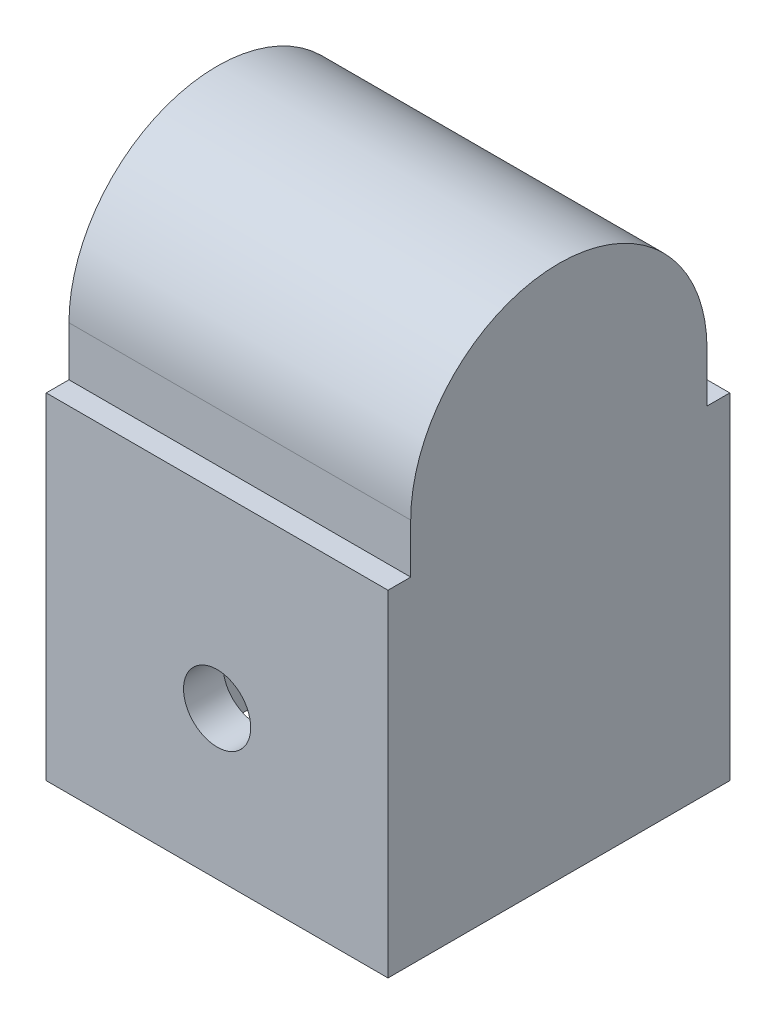
ISO-10303-21;
HEADER;
FILE_DESCRIPTION(('STEP AP214'),'2;1');
FILE_NAME('part.step','',(''),(''),'','','');
FILE_SCHEMA(('AUTOMOTIVE_DESIGN { 1 0 10303 214 1 1 1 1 }'));
ENDSEC;
DATA;
#1=APPLICATION_CONTEXT('core data for automotive mechanical design processes');
#2=APPLICATION_PROTOCOL_DEFINITION('international standard','automotive_design',2000,#1);
#3=PRODUCT_CONTEXT('',#1,'mechanical');
#4=PRODUCT('Part','Part','',(#3));
#5=PRODUCT_RELATED_PRODUCT_CATEGORY('part','',(#4));
#6=PRODUCT_DEFINITION_FORMATION('','',#4);
#7=PRODUCT_DEFINITION_CONTEXT('part definition',#1,'design');
#8=PRODUCT_DEFINITION('design','',#6,#7);
#9=PRODUCT_DEFINITION_SHAPE('','',#8);
#10=(LENGTH_UNIT() NAMED_UNIT(*) SI_UNIT(.MILLI.,.METRE.));
#11=(NAMED_UNIT(*) PLANE_ANGLE_UNIT() SI_UNIT($,.RADIAN.));
#12=(NAMED_UNIT(*) SI_UNIT($,.STERADIAN.) SOLID_ANGLE_UNIT());
#13=UNCERTAINTY_MEASURE_WITH_UNIT(LENGTH_MEASURE(1.E-05),#10,'distance_accuracy_value','');
#14=(GEOMETRIC_REPRESENTATION_CONTEXT(3) GLOBAL_UNCERTAINTY_ASSIGNED_CONTEXT((#13)) GLOBAL_UNIT_ASSIGNED_CONTEXT((#10,
#11,#12)) REPRESENTATION_CONTEXT('',''));
#15=CARTESIAN_POINT('',(0.,0.,0.));
#16=DIRECTION('',(0.,0.,1.));
#17=DIRECTION('',(1.,0.,0.));
#18=AXIS2_PLACEMENT_3D('',#15,#16,#17);
#19=CARTESIAN_POINT('',(0.,2.,0.));
#20=DIRECTION('',(0.,1.,0.));
#21=DIRECTION('',(0.,0.,1.));
#22=AXIS2_PLACEMENT_3D('',#19,#20,#21);
#23=PLANE('',#22);
#24=DIRECTION('',(0.,0.,-1.));
#25=VECTOR('',#24,1.);
#26=CARTESIAN_POINT('',(8.65,2.,0.));
#27=LINE('',#26,#25);
#28=CARTESIAN_POINT('',(8.65,2.,8.65));
#29=VERTEX_POINT('',#28);
#30=CARTESIAN_POINT('',(8.65,2.,7.5));
#31=VERTEX_POINT('',#30);
#32=EDGE_CURVE('E100',#29,#31,#27,.T.);
#33=ORIENTED_EDGE('',*,*,#32,.T.);
#34=DIRECTION('',(-1.,0.,0.));
#35=VECTOR('',#34,1.);
#36=CARTESIAN_POINT('',(8.65,2.,7.5));
#37=LINE('',#36,#35);
#38=CARTESIAN_POINT('',(-8.65,2.,7.5));
#39=VERTEX_POINT('',#38);
#40=EDGE_CURVE('E199',#31,#39,#37,.T.);
#41=ORIENTED_EDGE('',*,*,#40,.T.);
#42=DIRECTION('',(0.,0.,-1.));
#43=VECTOR('',#42,1.);
#44=CARTESIAN_POINT('',(-8.65,2.,0.));
#45=LINE('',#44,#43);
#46=CARTESIAN_POINT('',(-8.65,2.,8.65));
#47=VERTEX_POINT('',#46);
#48=EDGE_CURVE('E212',#47,#39,#45,.T.);
#49=ORIENTED_EDGE('',*,*,#48,.F.);
#50=DIRECTION('',(1.,0.,0.));
#51=VECTOR('',#50,1.);
#52=CARTESIAN_POINT('',(0.,2.,8.65));
#53=LINE('',#52,#51);
#54=EDGE_CURVE('E214',#47,#29,#53,.T.);
#55=ORIENTED_EDGE('',*,*,#54,.T.);
#56=EDGE_LOOP('',(#33,#41,#49,#55));
#57=FACE_BOUND('',#56,.T.);
#58=ADVANCED_FACE('F38',(#57),#23,.T.);
#59=CARTESIAN_POINT('',(-8.65,-15.,8.65));
#60=DIRECTION('',(-1.,0.,0.));
#61=DIRECTION('',(0.,0.,1.));
#62=AXIS2_PLACEMENT_3D('',#59,#60,#61);
#63=PLANE('',#62);
#64=DIRECTION('',(0.,1.,0.));
#65=VECTOR('',#64,1.);
#66=CARTESIAN_POINT('',(-8.65,-15.,8.65));
#67=LINE('',#66,#65);
#68=CARTESIAN_POINT('',(-8.65,-15.,8.65));
#69=VERTEX_POINT('',#68);
#70=EDGE_CURVE('E269',#69,#47,#67,.T.);
#71=ORIENTED_EDGE('',*,*,#70,.T.);
#72=ORIENTED_EDGE('',*,*,#48,.T.);
#73=DIRECTION('',(0.,-1.,0.));
#74=VECTOR('',#73,1.);
#75=CARTESIAN_POINT('',(-8.65,4.5,7.5));
#76=LINE('',#75,#74);
#77=CARTESIAN_POINT('',(-8.65,4.5,7.5));
#78=VERTEX_POINT('',#77);
#79=EDGE_CURVE('E187',#78,#39,#76,.T.);
#80=ORIENTED_EDGE('',*,*,#79,.F.);
#81=CARTESIAN_POINT('',(-8.65,4.5,0.));
#82=DIRECTION('',(1.,0.,0.));
#83=DIRECTION('',(0.,0.,-1.));
#84=AXIS2_PLACEMENT_3D('',#81,#82,#83);
#85=CIRCLE('',#84,7.5);
#86=CARTESIAN_POINT('',(-8.65,4.5,-7.5));
#87=VERTEX_POINT('',#86);
#88=EDGE_CURVE('E171',#87,#78,#85,.T.);
#89=ORIENTED_EDGE('',*,*,#88,.F.);
#90=DIRECTION('',(0.,1.,0.));
#91=VECTOR('',#90,1.);
#92=CARTESIAN_POINT('',(-8.65,2.,-7.5));
#93=LINE('',#92,#91);
#94=CARTESIAN_POINT('',(-8.65,2.,-7.5));
#95=VERTEX_POINT('',#94);
#96=EDGE_CURVE('E184',#95,#87,#93,.T.);
#97=ORIENTED_EDGE('',*,*,#96,.F.);
#98=CARTESIAN_POINT('',(-8.65,2.,-8.65));
#99=VERTEX_POINT('',#98);
#100=EDGE_CURVE('E211',#95,#99,#45,.T.);
#101=ORIENTED_EDGE('',*,*,#100,.T.);
#102=DIRECTION('',(0.,1.,0.));
#103=VECTOR('',#102,1.);
#104=CARTESIAN_POINT('',(-8.65,-15.,-8.65));
#105=LINE('',#104,#103);
#106=CARTESIAN_POINT('',(-8.65,-15.,-8.65));
#107=VERTEX_POINT('',#106);
#108=EDGE_CURVE('E270',#107,#99,#105,.T.);
#109=ORIENTED_EDGE('',*,*,#108,.F.);
#110=DIRECTION('',(0.,0.,1.));
#111=VECTOR('',#110,1.);
#112=CARTESIAN_POINT('',(-8.65,-15.,8.65));
#113=LINE('',#112,#111);
#114=EDGE_CURVE('E249',#107,#69,#113,.T.);
#115=ORIENTED_EDGE('',*,*,#114,.T.);
#116=EDGE_LOOP('',(#71,#72,#80,#89,#97,#101,#109,#115));
#117=FACE_BOUND('',#116,.T.);
#118=ADVANCED_FACE('F183',(#117),#63,.T.);
#119=CARTESIAN_POINT('',(-8.65,-15.,-8.65));
#120=DIRECTION('',(0.,0.,-1.));
#121=DIRECTION('',(-1.,0.,0.));
#122=AXIS2_PLACEMENT_3D('',#119,#120,#121);
#123=PLANE('',#122);
#124=CARTESIAN_POINT('',(0.,-7.5,-8.65));
#125=DIRECTION('',(0.,0.,1.));
#126=DIRECTION('',(1.,0.,0.));
#127=AXIS2_PLACEMENT_3D('',#124,#125,#126);
#128=CIRCLE('',#127,1.7);
#129=CARTESIAN_POINT('',(1.7,-7.5,-8.65));
#130=VERTEX_POINT('',#129);
#131=EDGE_CURVE('E204',#130,#130,#128,.T.);
#132=ORIENTED_EDGE('',*,*,#131,.T.);
#133=EDGE_LOOP('',(#132));
#134=FACE_BOUND('',#133,.T.);
#135=ORIENTED_EDGE('',*,*,#108,.T.);
#136=DIRECTION('',(1.,0.,0.));
#137=VECTOR('',#136,1.);
#138=CARTESIAN_POINT('',(0.,2.,-8.65));
#139=LINE('',#138,#137);
#140=CARTESIAN_POINT('',(8.65,2.,-8.65));
#141=VERTEX_POINT('',#140);
#142=EDGE_CURVE('E218',#99,#141,#139,.T.);
#143=ORIENTED_EDGE('',*,*,#142,.T.);
#144=DIRECTION('',(0.,1.,0.));
#145=VECTOR('',#144,1.);
#146=CARTESIAN_POINT('',(8.65,-15.,-8.65));
#147=LINE('',#146,#145);
#148=CARTESIAN_POINT('',(8.65,-15.,-8.65));
#149=VERTEX_POINT('',#148);
#150=EDGE_CURVE('E273',#149,#141,#147,.T.);
#151=ORIENTED_EDGE('',*,*,#150,.F.);
#152=DIRECTION('',(-1.,0.,0.));
#153=VECTOR('',#152,1.);
#154=CARTESIAN_POINT('',(-8.65,-15.,-8.65));
#155=LINE('',#154,#153);
#156=EDGE_CURVE('E266',#149,#107,#155,.T.);
#157=ORIENTED_EDGE('',*,*,#156,.T.);
#158=EDGE_LOOP('',(#135,#143,#151,#157));
#159=FACE_BOUND('',#158,.T.);
#160=ADVANCED_FACE('F415',(#134,#159),#123,.T.);
#161=CARTESIAN_POINT('',(8.65,-15.,8.65));
#162=DIRECTION('',(1.,0.,0.));
#163=DIRECTION('',(0.,0.,-1.));
#164=AXIS2_PLACEMENT_3D('',#161,#162,#163);
#165=PLANE('',#164);
#166=ORIENTED_EDGE('',*,*,#150,.T.);
#167=CARTESIAN_POINT('',(8.65,2.,-7.5));
#168=VERTEX_POINT('',#167);
#169=EDGE_CURVE('E216',#168,#141,#27,.T.);
#170=ORIENTED_EDGE('',*,*,#169,.F.);
#171=DIRECTION('',(0.,1.,0.));
#172=VECTOR('',#171,1.);
#173=CARTESIAN_POINT('',(8.65,2.,-7.5));
#174=LINE('',#173,#172);
#175=CARTESIAN_POINT('',(8.65,4.5,-7.5));
#176=VERTEX_POINT('',#175);
#177=EDGE_CURVE('E193',#168,#176,#174,.T.);
#178=ORIENTED_EDGE('',*,*,#177,.T.);
#179=CARTESIAN_POINT('',(8.65,4.5,0.));
#180=DIRECTION('',(1.,0.,0.));
#181=DIRECTION('',(0.,0.,-1.));
#182=AXIS2_PLACEMENT_3D('',#179,#180,#181);
#183=CIRCLE('',#182,7.5);
#184=CARTESIAN_POINT('',(8.65,4.5,7.5));
#185=VERTEX_POINT('',#184);
#186=EDGE_CURVE('E172',#176,#185,#183,.T.);
#187=ORIENTED_EDGE('',*,*,#186,.T.);
#188=DIRECTION('',(0.,-1.,0.));
#189=VECTOR('',#188,1.);
#190=CARTESIAN_POINT('',(8.65,4.5,7.5));
#191=LINE('',#190,#189);
#192=EDGE_CURVE('E196',#185,#31,#191,.T.);
#193=ORIENTED_EDGE('',*,*,#192,.T.);
#194=ORIENTED_EDGE('',*,*,#32,.F.);
#195=DIRECTION('',(0.,1.,0.));
#196=VECTOR('',#195,1.);
#197=CARTESIAN_POINT('',(8.65,-15.,8.65));
#198=LINE('',#197,#196);
#199=CARTESIAN_POINT('',(8.65,-15.,8.65));
#200=VERTEX_POINT('',#199);
#201=EDGE_CURVE('E276',#200,#29,#198,.T.);
#202=ORIENTED_EDGE('',*,*,#201,.F.);
#203=DIRECTION('',(0.,0.,-1.));
#204=VECTOR('',#203,1.);
#205=CARTESIAN_POINT('',(8.65,-15.,8.65));
#206=LINE('',#205,#204);
#207=EDGE_CURVE('E263',#200,#149,#206,.T.);
#208=ORIENTED_EDGE('',*,*,#207,.T.);
#209=EDGE_LOOP('',(#166,#170,#178,#187,#193,#194,#202,#208));
#210=FACE_BOUND('',#209,.T.);
#211=ADVANCED_FACE('F410',(#210),#165,.T.);
#212=CARTESIAN_POINT('',(-8.65,-15.,8.65));
#213=DIRECTION('',(0.,0.,1.));
#214=DIRECTION('',(1.,0.,0.));
#215=AXIS2_PLACEMENT_3D('',#212,#213,#214);
#216=PLANE('',#215);
#217=CARTESIAN_POINT('',(0.,-7.5,8.65));
#218=DIRECTION('',(0.,0.,1.));
#219=DIRECTION('',(1.,0.,0.));
#220=AXIS2_PLACEMENT_3D('',#217,#218,#219);
#221=CIRCLE('',#220,1.7);
#222=CARTESIAN_POINT('',(1.7,-7.5,8.65));
#223=VERTEX_POINT('',#222);
#224=EDGE_CURVE('E177',#223,#223,#221,.T.);
#225=ORIENTED_EDGE('',*,*,#224,.F.);
#226=EDGE_LOOP('',(#225));
#227=FACE_BOUND('',#226,.T.);
#228=ORIENTED_EDGE('',*,*,#201,.T.);
#229=ORIENTED_EDGE('',*,*,#54,.F.);
#230=ORIENTED_EDGE('',*,*,#70,.F.);
#231=DIRECTION('',(1.,0.,0.));
#232=VECTOR('',#231,1.);
#233=CARTESIAN_POINT('',(-8.65,-15.,8.65));
#234=LINE('',#233,#232);
#235=EDGE_CURVE('E260',#69,#200,#234,.T.);
#236=ORIENTED_EDGE('',*,*,#235,.T.);
#237=EDGE_LOOP('',(#228,#229,#230,#236));
#238=FACE_BOUND('',#237,.T.);
#239=ADVANCED_FACE('F414',(#227,#238),#216,.T.);
#240=CARTESIAN_POINT('',(0.,-15.,0.));
#241=DIRECTION('',(0.,-1.,0.));
#242=DIRECTION('',(0.,0.,-1.));
#243=AXIS2_PLACEMENT_3D('',#240,#241,#242);
#244=PLANE('',#243);
#245=DIRECTION('',(0.,0.,-1.));
#246=VECTOR('',#245,1.);
#247=CARTESIAN_POINT('',(6.65,-15.,6.65));
#248=LINE('',#247,#246);
#249=CARTESIAN_POINT('',(6.65,-15.,6.65));
#250=VERTEX_POINT('',#249);
#251=CARTESIAN_POINT('',(6.65,-15.,-6.65));
#252=VERTEX_POINT('',#251);
#253=EDGE_CURVE('E222',#250,#252,#248,.T.);
#254=ORIENTED_EDGE('',*,*,#253,.T.);
#255=DIRECTION('',(-1.,0.,0.));
#256=VECTOR('',#255,1.);
#257=CARTESIAN_POINT('',(-6.65,-15.,-6.65));
#258=LINE('',#257,#256);
#259=CARTESIAN_POINT('',(-6.65,-15.,-6.65));
#260=VERTEX_POINT('',#259);
#261=EDGE_CURVE('E225',#252,#260,#258,.T.);
#262=ORIENTED_EDGE('',*,*,#261,.T.);
#263=DIRECTION('',(0.,0.,1.));
#264=VECTOR('',#263,1.);
#265=CARTESIAN_POINT('',(-6.65,-15.,6.65));
#266=LINE('',#265,#264);
#267=CARTESIAN_POINT('',(-6.65,-15.,6.65));
#268=VERTEX_POINT('',#267);
#269=EDGE_CURVE('E229',#260,#268,#266,.T.);
#270=ORIENTED_EDGE('',*,*,#269,.T.);
#271=DIRECTION('',(1.,0.,0.));
#272=VECTOR('',#271,1.);
#273=CARTESIAN_POINT('',(-6.65,-15.,6.65));
#274=LINE('',#273,#272);
#275=EDGE_CURVE('E232',#268,#250,#274,.T.);
#276=ORIENTED_EDGE('',*,*,#275,.T.);
#277=EDGE_LOOP('',(#254,#262,#270,#276));
#278=FACE_BOUND('',#277,.T.);
#279=ORIENTED_EDGE('',*,*,#114,.F.);
#280=ORIENTED_EDGE('',*,*,#156,.F.);
#281=ORIENTED_EDGE('',*,*,#207,.F.);
#282=ORIENTED_EDGE('',*,*,#235,.F.);
#283=EDGE_LOOP('',(#279,#280,#281,#282));
#284=FACE_BOUND('',#283,.T.);
#285=ADVANCED_FACE('F482',(#278,#284),#244,.T.);
#286=CARTESIAN_POINT('',(6.65,-15.,6.65));
#287=DIRECTION('',(1.,0.,0.));
#288=DIRECTION('',(0.,0.,-1.));
#289=AXIS2_PLACEMENT_3D('',#286,#287,#288);
#290=PLANE('',#289);
#291=DIRECTION('',(0.,0.,-1.));
#292=VECTOR('',#291,1.);
#293=CARTESIAN_POINT('',(6.65,0.,6.65));
#294=LINE('',#293,#292);
#295=CARTESIAN_POINT('',(6.65,0.,6.65));
#296=VERTEX_POINT('',#295);
#297=CARTESIAN_POINT('',(6.65,0.,-6.65));
#298=VERTEX_POINT('',#297);
#299=EDGE_CURVE('E221',#296,#298,#294,.T.);
#300=ORIENTED_EDGE('',*,*,#299,.T.);
#301=DIRECTION('',(0.,1.,0.));
#302=VECTOR('',#301,1.);
#303=CARTESIAN_POINT('',(6.65,-15.,-6.65));
#304=LINE('',#303,#302);
#305=EDGE_CURVE('E235',#252,#298,#304,.T.);
#306=ORIENTED_EDGE('',*,*,#305,.F.);
#307=ORIENTED_EDGE('',*,*,#253,.F.);
#308=DIRECTION('',(0.,1.,0.));
#309=VECTOR('',#308,1.);
#310=CARTESIAN_POINT('',(6.65,-15.,6.65));
#311=LINE('',#310,#309);
#312=EDGE_CURVE('E246',#250,#296,#311,.T.);
#313=ORIENTED_EDGE('',*,*,#312,.T.);
#314=EDGE_LOOP('',(#300,#306,#307,#313));
#315=FACE_BOUND('',#314,.T.);
#316=ADVANCED_FACE('F471',(#315),#290,.F.);
#317=CARTESIAN_POINT('',(-6.65,-15.,6.65));
#318=DIRECTION('',(0.,0.,1.));
#319=DIRECTION('',(1.,0.,0.));
#320=AXIS2_PLACEMENT_3D('',#317,#318,#319);
#321=PLANE('',#320);
#322=CARTESIAN_POINT('',(0.,-7.5,6.65));
#323=DIRECTION('',(0.,0.,1.));
#324=DIRECTION('',(1.,0.,0.));
#325=AXIS2_PLACEMENT_3D('',#322,#323,#324);
#326=CIRCLE('',#325,1.7);
#327=CARTESIAN_POINT('',(1.7,-7.5,6.65));
#328=VERTEX_POINT('',#327);
#329=EDGE_CURVE('E208',#328,#328,#326,.T.);
#330=ORIENTED_EDGE('',*,*,#329,.T.);
#331=EDGE_LOOP('',(#330));
#332=FACE_BOUND('',#331,.T.);
#333=DIRECTION('',(1.,0.,0.));
#334=VECTOR('',#333,1.);
#335=CARTESIAN_POINT('',(-6.65,0.,6.65));
#336=LINE('',#335,#334);
#337=CARTESIAN_POINT('',(-6.65,0.,6.65));
#338=VERTEX_POINT('',#337);
#339=EDGE_CURVE('E226',#338,#296,#336,.T.);
#340=ORIENTED_EDGE('',*,*,#339,.T.);
#341=ORIENTED_EDGE('',*,*,#312,.F.);
#342=ORIENTED_EDGE('',*,*,#275,.F.);
#343=DIRECTION('',(0.,1.,0.));
#344=VECTOR('',#343,1.);
#345=CARTESIAN_POINT('',(-6.65,-15.,6.65));
#346=LINE('',#345,#344);
#347=EDGE_CURVE('E250',#268,#338,#346,.T.);
#348=ORIENTED_EDGE('',*,*,#347,.T.);
#349=EDGE_LOOP('',(#340,#341,#342,#348));
#350=FACE_BOUND('',#349,.T.);
#351=ADVANCED_FACE('F466',(#332,#350),#321,.F.);
#352=CARTESIAN_POINT('',(-6.65,-15.,6.65));
#353=DIRECTION('',(-1.,0.,0.));
#354=DIRECTION('',(0.,0.,1.));
#355=AXIS2_PLACEMENT_3D('',#352,#353,#354);
#356=PLANE('',#355);
#357=DIRECTION('',(0.,0.,1.));
#358=VECTOR('',#357,1.);
#359=CARTESIAN_POINT('',(-6.65,0.,6.65));
#360=LINE('',#359,#358);
#361=CARTESIAN_POINT('',(-6.65,0.,-6.65));
#362=VERTEX_POINT('',#361);
#363=EDGE_CURVE('E241',#362,#338,#360,.T.);
#364=ORIENTED_EDGE('',*,*,#363,.T.);
#365=ORIENTED_EDGE('',*,*,#347,.F.);
#366=ORIENTED_EDGE('',*,*,#269,.F.);
#367=DIRECTION('',(0.,1.,0.));
#368=VECTOR('',#367,1.);
#369=CARTESIAN_POINT('',(-6.65,-15.,-6.65));
#370=LINE('',#369,#368);
#371=EDGE_CURVE('E253',#260,#362,#370,.T.);
#372=ORIENTED_EDGE('',*,*,#371,.T.);
#373=EDGE_LOOP('',(#364,#365,#366,#372));
#374=FACE_BOUND('',#373,.T.);
#375=ADVANCED_FACE('F458',(#374),#356,.F.);
#376=CARTESIAN_POINT('',(-6.65,-15.,-6.65));
#377=DIRECTION('',(0.,0.,-1.));
#378=DIRECTION('',(-1.,0.,0.));
#379=AXIS2_PLACEMENT_3D('',#376,#377,#378);
#380=PLANE('',#379);
#381=CARTESIAN_POINT('',(0.,-7.5,-6.65));
#382=DIRECTION('',(0.,0.,-1.));
#383=DIRECTION('',(-1.,0.,0.));
#384=AXIS2_PLACEMENT_3D('',#381,#382,#383);
#385=CIRCLE('',#384,1.7);
#386=CARTESIAN_POINT('',(-1.7,-7.5,-6.65));
#387=VERTEX_POINT('',#386);
#388=EDGE_CURVE('E207',#387,#387,#385,.T.);
#389=ORIENTED_EDGE('',*,*,#388,.T.);
#390=EDGE_LOOP('',(#389));
#391=FACE_BOUND('',#390,.T.);
#392=DIRECTION('',(-1.,0.,0.));
#393=VECTOR('',#392,1.);
#394=CARTESIAN_POINT('',(-6.65,0.,-6.65));
#395=LINE('',#394,#393);
#396=EDGE_CURVE('E238',#298,#362,#395,.T.);
#397=ORIENTED_EDGE('',*,*,#396,.T.);
#398=ORIENTED_EDGE('',*,*,#371,.F.);
#399=ORIENTED_EDGE('',*,*,#261,.F.);
#400=ORIENTED_EDGE('',*,*,#305,.T.);
#401=EDGE_LOOP('',(#397,#398,#399,#400));
#402=FACE_BOUND('',#401,.T.);
#403=ADVANCED_FACE('F453',(#391,#402),#380,.F.);
#404=CARTESIAN_POINT('',(0.,0.,0.));
#405=DIRECTION('',(0.,1.,0.));
#406=DIRECTION('',(0.,0.,1.));
#407=AXIS2_PLACEMENT_3D('',#404,#405,#406);
#408=PLANE('',#407);
#409=ORIENTED_EDGE('',*,*,#396,.F.);
#410=ORIENTED_EDGE('',*,*,#299,.F.);
#411=ORIENTED_EDGE('',*,*,#339,.F.);
#412=ORIENTED_EDGE('',*,*,#363,.F.);
#413=EDGE_LOOP('',(#409,#410,#411,#412));
#414=FACE_BOUND('',#413,.T.);
#415=ADVANCED_FACE('F401',(#414),#408,.F.);
#416=DIRECTION('',(-1.,0.,0.));
#417=VECTOR('',#416,1.);
#418=CARTESIAN_POINT('',(8.65,2.,-7.5));
#419=LINE('',#418,#417);
#420=EDGE_CURVE('E92',#168,#95,#419,.T.);
#421=ORIENTED_EDGE('',*,*,#420,.F.);
#422=ORIENTED_EDGE('',*,*,#169,.T.);
#423=ORIENTED_EDGE('',*,*,#142,.F.);
#424=ORIENTED_EDGE('',*,*,#100,.F.);
#425=EDGE_LOOP('',(#421,#422,#423,#424));
#426=FACE_BOUND('',#425,.T.);
#427=ADVANCED_FACE('F395',(#426),#23,.T.);
#428=CARTESIAN_POINT('',(0.,-7.5,-8.65));
#429=DIRECTION('',(0.,0.,1.));
#430=DIRECTION('',(1.,0.,0.));
#431=AXIS2_PLACEMENT_3D('',#428,#429,#430);
#432=CYLINDRICAL_SURFACE('',#431,1.7);
#433=ORIENTED_EDGE('',*,*,#131,.F.);
#434=EDGE_LOOP('',(#433));
#435=FACE_BOUND('',#434,.T.);
#436=ORIENTED_EDGE('',*,*,#388,.F.);
#437=EDGE_LOOP('',(#436));
#438=FACE_BOUND('',#437,.T.);
#439=ADVANCED_FACE('F400',(#435,#438),#432,.F.);
#440=ORIENTED_EDGE('',*,*,#224,.T.);
#441=EDGE_LOOP('',(#440));
#442=FACE_BOUND('',#441,.T.);
#443=ORIENTED_EDGE('',*,*,#329,.F.);
#444=EDGE_LOOP('',(#443));
#445=FACE_BOUND('',#444,.T.);
#446=ADVANCED_FACE('F388',(#442,#445),#432,.F.);
#447=CARTESIAN_POINT('',(8.65,2.,-7.5));
#448=DIRECTION('',(0.,0.,1.));
#449=DIRECTION('',(1.,0.,0.));
#450=AXIS2_PLACEMENT_3D('',#447,#448,#449);
#451=PLANE('',#450);
#452=ORIENTED_EDGE('',*,*,#420,.T.);
#453=ORIENTED_EDGE('',*,*,#96,.T.);
#454=DIRECTION('',(-1.,0.,0.));
#455=VECTOR('',#454,1.);
#456=CARTESIAN_POINT('',(8.65,4.5,-7.5));
#457=LINE('',#456,#455);
#458=EDGE_CURVE('E167',#176,#87,#457,.T.);
#459=ORIENTED_EDGE('',*,*,#458,.F.);
#460=ORIENTED_EDGE('',*,*,#177,.F.);
#461=EDGE_LOOP('',(#452,#453,#459,#460));
#462=FACE_BOUND('',#461,.T.);
#463=ADVANCED_FACE('F189',(#462),#451,.F.);
#464=CARTESIAN_POINT('',(8.65,4.5,0.));
#465=DIRECTION('',(-1.,0.,0.));
#466=DIRECTION('',(0.,0.,1.));
#467=AXIS2_PLACEMENT_3D('',#464,#465,#466);
#468=CYLINDRICAL_SURFACE('',#467,7.5);
#469=ORIENTED_EDGE('',*,*,#458,.T.);
#470=ORIENTED_EDGE('',*,*,#88,.T.);
#471=DIRECTION('',(-1.,0.,0.));
#472=VECTOR('',#471,1.);
#473=CARTESIAN_POINT('',(8.65,4.5,7.5));
#474=LINE('',#473,#472);
#475=EDGE_CURVE('E178',#185,#78,#474,.T.);
#476=ORIENTED_EDGE('',*,*,#475,.F.);
#477=ORIENTED_EDGE('',*,*,#186,.F.);
#478=EDGE_LOOP('',(#469,#470,#476,#477));
#479=FACE_BOUND('',#478,.T.);
#480=ADVANCED_FACE('F169',(#479),#468,.T.);
#481=CARTESIAN_POINT('',(8.65,4.5,7.5));
#482=DIRECTION('',(0.,0.,-1.));
#483=DIRECTION('',(-1.,0.,0.));
#484=AXIS2_PLACEMENT_3D('',#481,#482,#483);
#485=PLANE('',#484);
#486=ORIENTED_EDGE('',*,*,#475,.T.);
#487=ORIENTED_EDGE('',*,*,#79,.T.);
#488=ORIENTED_EDGE('',*,*,#40,.F.);
#489=ORIENTED_EDGE('',*,*,#192,.F.);
#490=EDGE_LOOP('',(#486,#487,#488,#489));
#491=FACE_BOUND('',#490,.T.);
#492=ADVANCED_FACE('F366',(#491),#485,.F.);
#493=CLOSED_SHELL('',(#58,#118,#160,#211,#239,#285,#316,#351,#375,#403,#415,#427,#439,#446,#463,
#480,#492));
#494=CARTESIAN_POINT('',(0.,2.,0.));
#495=DIRECTION('',(0.,1.,0.));
#496=DIRECTION('',(0.,0.,1.));
#497=AXIS2_PLACEMENT_3D('',#494,#495,#496);
#498=PLANE('',#497);
#499=DIRECTION('',(0.,0.,-1.));
#500=VECTOR('',#499,1.);
#501=CARTESIAN_POINT('',(-6.65,2.,8.65));
#502=LINE('',#501,#500);
#503=CARTESIAN_POINT('',(-6.65,2.,5.5));
#504=VERTEX_POINT('',#503);
#505=CARTESIAN_POINT('',(-6.65,2.,-5.5));
#506=VERTEX_POINT('',#505);
#507=EDGE_CURVE('E42',#504,#506,#502,.T.);
#508=ORIENTED_EDGE('',*,*,#507,.F.);
#509=DIRECTION('',(-1.,0.,0.));
#510=VECTOR('',#509,1.);
#511=CARTESIAN_POINT('',(0.,2.,5.5));
#512=LINE('',#511,#510);
#513=CARTESIAN_POINT('',(6.65,2.,5.5));
#514=VERTEX_POINT('',#513);
#515=EDGE_CURVE('E297',#514,#504,#512,.T.);
#516=ORIENTED_EDGE('',*,*,#515,.F.);
#517=DIRECTION('',(0.,0.,1.));
#518=VECTOR('',#517,1.);
#519=CARTESIAN_POINT('',(6.65,2.,8.65));
#520=LINE('',#519,#518);
#521=CARTESIAN_POINT('',(6.65,2.,-5.5));
#522=VERTEX_POINT('',#521);
#523=EDGE_CURVE('E80',#522,#514,#520,.T.);
#524=ORIENTED_EDGE('',*,*,#523,.F.);
#525=DIRECTION('',(1.,0.,0.));
#526=VECTOR('',#525,1.);
#527=CARTESIAN_POINT('',(0.,2.,-5.5));
#528=LINE('',#527,#526);
#529=EDGE_CURVE('E299',#506,#522,#528,.T.);
#530=ORIENTED_EDGE('',*,*,#529,.F.);
#531=EDGE_LOOP('',(#508,#516,#524,#530));
#532=FACE_BOUND('',#531,.T.);
#533=ADVANCED_FACE('F311',(#532),#498,.T.);
#534=CARTESIAN_POINT('',(-6.65,-15.,8.65));
#535=DIRECTION('',(-1.,0.,0.));
#536=DIRECTION('',(0.,0.,1.));
#537=AXIS2_PLACEMENT_3D('',#534,#535,#536);
#538=PLANE('',#537);
#539=ORIENTED_EDGE('',*,*,#507,.T.);
#540=DIRECTION('',(0.,1.,0.));
#541=VECTOR('',#540,1.);
#542=CARTESIAN_POINT('',(-6.65,-15.,-5.5));
#543=LINE('',#542,#541);
#544=CARTESIAN_POINT('',(-6.65,4.5,-5.5));
#545=VERTEX_POINT('',#544);
#546=EDGE_CURVE('E288',#506,#545,#543,.T.);
#547=ORIENTED_EDGE('',*,*,#546,.T.);
#548=CARTESIAN_POINT('',(-6.65,4.5,0.));
#549=DIRECTION('',(-1.,0.,0.));
#550=DIRECTION('',(0.,0.,1.));
#551=AXIS2_PLACEMENT_3D('',#548,#549,#550);
#552=CIRCLE('',#551,5.5);
#553=CARTESIAN_POINT('',(-6.65,4.5,5.5));
#554=VERTEX_POINT('',#553);
#555=EDGE_CURVE('E282',#545,#554,#552,.F.);
#556=ORIENTED_EDGE('',*,*,#555,.T.);
#557=DIRECTION('',(0.,-1.,0.));
#558=VECTOR('',#557,1.);
#559=CARTESIAN_POINT('',(-6.65,-15.,5.5));
#560=LINE('',#559,#558);
#561=EDGE_CURVE('E11',#554,#504,#560,.T.);
#562=ORIENTED_EDGE('',*,*,#561,.T.);
#563=EDGE_LOOP('',(#539,#547,#556,#562));
#564=FACE_BOUND('',#563,.T.);
#565=ADVANCED_FACE('F309',(#564),#538,.F.);
#566=CARTESIAN_POINT('',(6.65,-15.,8.65));
#567=DIRECTION('',(1.,0.,0.));
#568=DIRECTION('',(0.,0.,-1.));
#569=AXIS2_PLACEMENT_3D('',#566,#567,#568);
#570=PLANE('',#569);
#571=ORIENTED_EDGE('',*,*,#523,.T.);
#572=DIRECTION('',(0.,-1.,0.));
#573=VECTOR('',#572,1.);
#574=CARTESIAN_POINT('',(6.65,4.5,5.5));
#575=LINE('',#574,#573);
#576=CARTESIAN_POINT('',(6.65,4.5,5.5));
#577=VERTEX_POINT('',#576);
#578=EDGE_CURVE('E290',#577,#514,#575,.T.);
#579=ORIENTED_EDGE('',*,*,#578,.F.);
#580=CARTESIAN_POINT('',(6.65,4.5,0.));
#581=DIRECTION('',(1.,0.,0.));
#582=DIRECTION('',(0.,0.,-1.));
#583=AXIS2_PLACEMENT_3D('',#580,#581,#582);
#584=CIRCLE('',#583,5.5);
#585=CARTESIAN_POINT('',(6.65,4.5,-5.5));
#586=VERTEX_POINT('',#585);
#587=EDGE_CURVE('E293',#586,#577,#584,.T.);
#588=ORIENTED_EDGE('',*,*,#587,.F.);
#589=DIRECTION('',(0.,1.,0.));
#590=VECTOR('',#589,1.);
#591=CARTESIAN_POINT('',(6.65,2.,-5.5));
#592=LINE('',#591,#590);
#593=EDGE_CURVE('E295',#522,#586,#592,.T.);
#594=ORIENTED_EDGE('',*,*,#593,.F.);
#595=EDGE_LOOP('',(#571,#579,#588,#594));
#596=FACE_BOUND('',#595,.T.);
#597=ADVANCED_FACE('F306',(#596),#570,.F.);
#598=CARTESIAN_POINT('',(8.65,2.,-5.5));
#599=DIRECTION('',(0.,0.,1.));
#600=DIRECTION('',(1.,0.,0.));
#601=AXIS2_PLACEMENT_3D('',#598,#599,#600);
#602=PLANE('',#601);
#603=ORIENTED_EDGE('',*,*,#529,.T.);
#604=ORIENTED_EDGE('',*,*,#593,.T.);
#605=DIRECTION('',(-1.,0.,0.));
#606=VECTOR('',#605,1.);
#607=CARTESIAN_POINT('',(8.65,4.5,-5.5));
#608=LINE('',#607,#606);
#609=EDGE_CURVE('E285',#586,#545,#608,.T.);
#610=ORIENTED_EDGE('',*,*,#609,.T.);
#611=ORIENTED_EDGE('',*,*,#546,.F.);
#612=EDGE_LOOP('',(#603,#604,#610,#611));
#613=FACE_BOUND('',#612,.T.);
#614=ADVANCED_FACE('F303',(#613),#602,.T.);
#615=CARTESIAN_POINT('',(8.65,4.5,0.));
#616=DIRECTION('',(-1.,0.,0.));
#617=DIRECTION('',(0.,0.,1.));
#618=AXIS2_PLACEMENT_3D('',#615,#616,#617);
#619=CYLINDRICAL_SURFACE('',#618,5.5);
#620=ORIENTED_EDGE('',*,*,#609,.F.);
#621=ORIENTED_EDGE('',*,*,#587,.T.);
#622=DIRECTION('',(-1.,0.,0.));
#623=VECTOR('',#622,1.);
#624=CARTESIAN_POINT('',(8.65,4.5,5.5));
#625=LINE('',#624,#623);
#626=EDGE_CURVE('E49',#577,#554,#625,.T.);
#627=ORIENTED_EDGE('',*,*,#626,.T.);
#628=ORIENTED_EDGE('',*,*,#555,.F.);
#629=EDGE_LOOP('',(#620,#621,#627,#628));
#630=FACE_BOUND('',#629,.T.);
#631=ADVANCED_FACE('F308',(#630),#619,.F.);
#632=CARTESIAN_POINT('',(8.65,4.5,5.5));
#633=DIRECTION('',(0.,0.,-1.));
#634=DIRECTION('',(-1.,0.,0.));
#635=AXIS2_PLACEMENT_3D('',#632,#633,#634);
#636=PLANE('',#635);
#637=ORIENTED_EDGE('',*,*,#515,.T.);
#638=ORIENTED_EDGE('',*,*,#561,.F.);
#639=ORIENTED_EDGE('',*,*,#626,.F.);
#640=ORIENTED_EDGE('',*,*,#578,.T.);
#641=EDGE_LOOP('',(#637,#638,#639,#640));
#642=FACE_BOUND('',#641,.T.);
#643=ADVANCED_FACE('F40',(#642),#636,.T.);
#644=CLOSED_SHELL('',(#533,#565,#597,#614,#631,#643));
#645=ORIENTED_CLOSED_SHELL('',*,#644,.T.);
#646=BREP_WITH_VOIDS('B2',#493,(#645));
#647=ADVANCED_BREP_SHAPE_REPRESENTATION('',(#18,#646),#14);
#648=SHAPE_DEFINITION_REPRESENTATION(#9,#647);
ENDSEC;
END-ISO-10303-21;
